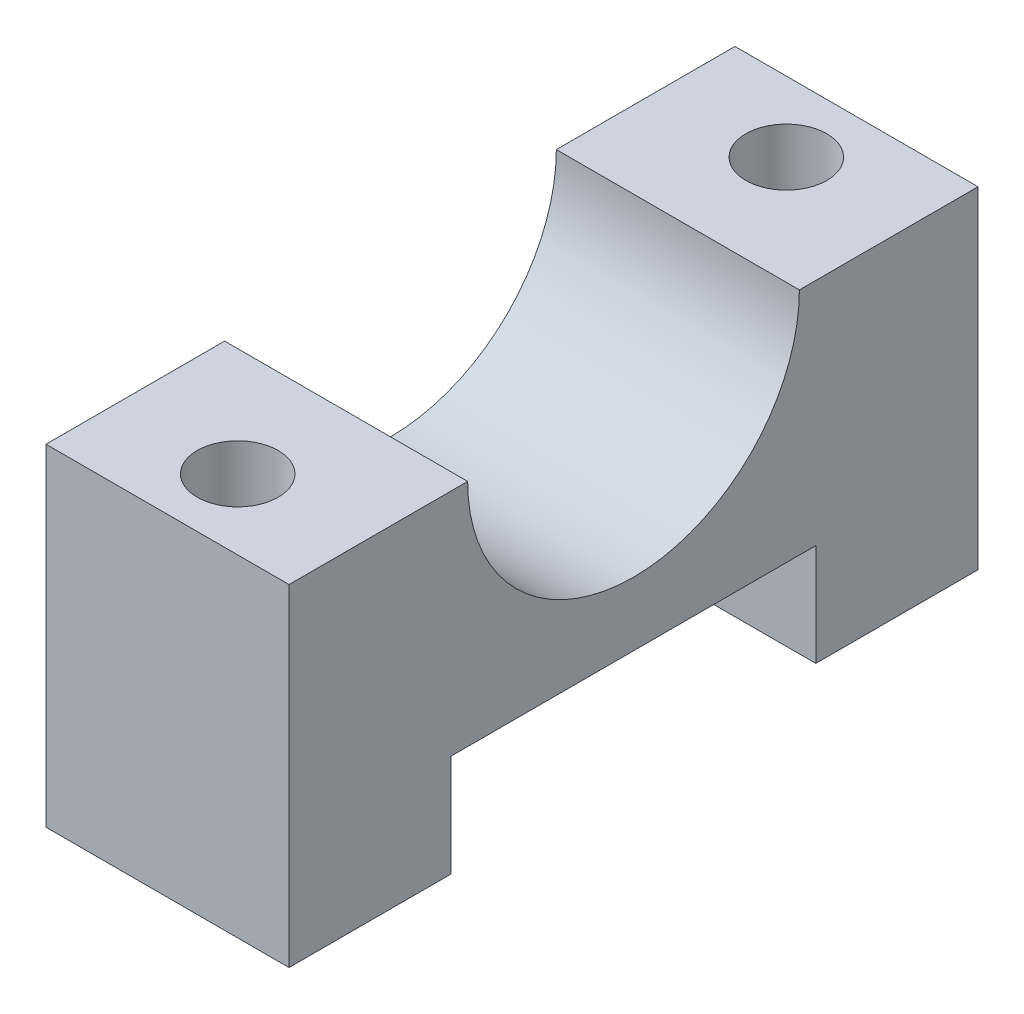
ISO-10303-21;
HEADER;
FILE_DESCRIPTION(('STEP AP214'),'2;1');
FILE_NAME('part.step','',(''),(''),'','','');
FILE_SCHEMA(('AUTOMOTIVE_DESIGN { 1 0 10303 214 1 1 1 1 }'));
ENDSEC;
DATA;
#1=APPLICATION_CONTEXT('core data for automotive mechanical design processes');
#2=APPLICATION_PROTOCOL_DEFINITION('international standard','automotive_design',2000,#1);
#3=PRODUCT_CONTEXT('',#1,'mechanical');
#4=PRODUCT('Part','Part','',(#3));
#5=PRODUCT_RELATED_PRODUCT_CATEGORY('part','',(#4));
#6=PRODUCT_DEFINITION_FORMATION('','',#4);
#7=PRODUCT_DEFINITION_CONTEXT('part definition',#1,'design');
#8=PRODUCT_DEFINITION('design','',#6,#7);
#9=PRODUCT_DEFINITION_SHAPE('','',#8);
#10=(LENGTH_UNIT() NAMED_UNIT(*) SI_UNIT(.MILLI.,.METRE.));
#11=(NAMED_UNIT(*) PLANE_ANGLE_UNIT() SI_UNIT($,.RADIAN.));
#12=(NAMED_UNIT(*) SI_UNIT($,.STERADIAN.) SOLID_ANGLE_UNIT());
#13=UNCERTAINTY_MEASURE_WITH_UNIT(LENGTH_MEASURE(1.E-05),#10,'distance_accuracy_value','');
#14=(GEOMETRIC_REPRESENTATION_CONTEXT(3) GLOBAL_UNCERTAINTY_ASSIGNED_CONTEXT((#13)) GLOBAL_UNIT_ASSIGNED_CONTEXT((#10,
#11,#12)) REPRESENTATION_CONTEXT('',''));
#15=CARTESIAN_POINT('',(0.,0.,0.));
#16=DIRECTION('',(0.,0.,1.));
#17=DIRECTION('',(1.,0.,0.));
#18=AXIS2_PLACEMENT_3D('',#15,#16,#17);
#19=CARTESIAN_POINT('',(9.525,-13.,13.5));
#20=DIRECTION('',(0.,1.,0.));
#21=DIRECTION('',(0.,0.,1.));
#22=AXIS2_PLACEMENT_3D('',#19,#20,#21);
#23=PLANE('',#22);
#24=CARTESIAN_POINT('',(4.7625,-13.,10.75));
#25=DIRECTION('',(0.,-1.,0.));
#26=DIRECTION('',(0.,0.,-1.));
#27=AXIS2_PLACEMENT_3D('',#24,#25,#26);
#28=CIRCLE('',#27,1.5875);
#29=CARTESIAN_POINT('',(4.7625,-13.,9.1625));
#30=VERTEX_POINT('',#29);
#31=EDGE_CURVE('E229',#30,#30,#28,.T.);
#32=ORIENTED_EDGE('',*,*,#31,.F.);
#33=EDGE_LOOP('',(#32));
#34=FACE_BOUND('',#33,.T.);
#35=DIRECTION('',(0.,0.,-1.));
#36=VECTOR('',#35,1.);
#37=CARTESIAN_POINT('',(0.,-13.,13.5));
#38=LINE('',#37,#36);
#39=CARTESIAN_POINT('',(0.,-13.,13.5));
#40=VERTEX_POINT('',#39);
#41=CARTESIAN_POINT('',(0.,-13.,7.14375));
#42=VERTEX_POINT('',#41);
#43=EDGE_CURVE('E137',#40,#42,#38,.T.);
#44=ORIENTED_EDGE('',*,*,#43,.T.);
#45=DIRECTION('',(1.,0.,0.));
#46=VECTOR('',#45,1.);
#47=CARTESIAN_POINT('',(0.,-13.,7.14375));
#48=LINE('',#47,#46);
#49=CARTESIAN_POINT('',(9.525,-13.,7.14375));
#50=VERTEX_POINT('',#49);
#51=EDGE_CURVE('E170',#42,#50,#48,.T.);
#52=ORIENTED_EDGE('',*,*,#51,.T.);
#53=DIRECTION('',(0.,0.,-1.));
#54=VECTOR('',#53,1.);
#55=CARTESIAN_POINT('',(9.525,-13.,13.5));
#56=LINE('',#55,#54);
#57=CARTESIAN_POINT('',(9.525,-13.,13.5));
#58=VERTEX_POINT('',#57);
#59=EDGE_CURVE('E92',#58,#50,#56,.T.);
#60=ORIENTED_EDGE('',*,*,#59,.F.);
#61=DIRECTION('',(-1.,0.,0.));
#62=VECTOR('',#61,1.);
#63=CARTESIAN_POINT('',(9.525,-13.,13.5));
#64=LINE('',#63,#62);
#65=EDGE_CURVE('E11',#58,#40,#64,.T.);
#66=ORIENTED_EDGE('',*,*,#65,.T.);
#67=EDGE_LOOP('',(#44,#52,#60,#66));
#68=FACE_BOUND('',#67,.T.);
#69=ADVANCED_FACE('F33',(#34,#68),#23,.F.);
#70=CARTESIAN_POINT('',(9.525,0.,13.5));
#71=DIRECTION('',(0.,0.,-1.));
#72=DIRECTION('',(0.,1.,0.));
#73=AXIS2_PLACEMENT_3D('',#70,#71,#72);
#74=PLANE('',#73);
#75=DIRECTION('',(0.,-1.,0.));
#76=VECTOR('',#75,1.);
#77=CARTESIAN_POINT('',(0.,0.,13.5));
#78=LINE('',#77,#76);
#79=CARTESIAN_POINT('',(0.,0.,13.5));
#80=VERTEX_POINT('',#79);
#81=EDGE_CURVE('E132',#80,#40,#78,.T.);
#82=ORIENTED_EDGE('',*,*,#81,.T.);
#83=ORIENTED_EDGE('',*,*,#65,.F.);
#84=DIRECTION('',(0.,-1.,0.));
#85=VECTOR('',#84,1.);
#86=CARTESIAN_POINT('',(9.525,0.,13.5));
#87=LINE('',#86,#85);
#88=CARTESIAN_POINT('',(9.525,0.,13.5));
#89=VERTEX_POINT('',#88);
#90=EDGE_CURVE('E146',#89,#58,#87,.T.);
#91=ORIENTED_EDGE('',*,*,#90,.F.);
#92=DIRECTION('',(-1.,0.,0.));
#93=VECTOR('',#92,1.);
#94=CARTESIAN_POINT('',(9.525,0.,13.5));
#95=LINE('',#94,#93);
#96=EDGE_CURVE('E128',#89,#80,#95,.T.);
#97=ORIENTED_EDGE('',*,*,#96,.T.);
#98=EDGE_LOOP('',(#82,#83,#91,#97));
#99=FACE_BOUND('',#98,.T.);
#100=ADVANCED_FACE('F35',(#99),#74,.F.);
#101=CARTESIAN_POINT('',(4.7625,-13.,-10.75));
#102=DIRECTION('',(0.,-1.,0.));
#103=DIRECTION('',(0.,0.,-1.));
#104=AXIS2_PLACEMENT_3D('',#101,#102,#103);
#105=CIRCLE('',#104,1.5875);
#106=CARTESIAN_POINT('',(4.7625,-13.,-12.3375));
#107=VERTEX_POINT('',#106);
#108=EDGE_CURVE('E234',#107,#107,#105,.T.);
#109=ORIENTED_EDGE('',*,*,#108,.F.);
#110=EDGE_LOOP('',(#109));
#111=FACE_BOUND('',#110,.T.);
#112=CARTESIAN_POINT('',(9.525,-13.,-7.14375));
#113=VERTEX_POINT('',#112);
#114=CARTESIAN_POINT('',(9.525,-13.,-13.5));
#115=VERTEX_POINT('',#114);
#116=EDGE_CURVE('E166',#113,#115,#56,.T.);
#117=ORIENTED_EDGE('',*,*,#116,.F.);
#118=DIRECTION('',(1.,0.,0.));
#119=VECTOR('',#118,1.);
#120=CARTESIAN_POINT('',(0.,-13.,-7.14375));
#121=LINE('',#120,#119);
#122=CARTESIAN_POINT('',(0.,-13.,-7.14375));
#123=VERTEX_POINT('',#122);
#124=EDGE_CURVE('E204',#123,#113,#121,.T.);
#125=ORIENTED_EDGE('',*,*,#124,.F.);
#126=CARTESIAN_POINT('',(0.,-13.,-13.5));
#127=VERTEX_POINT('',#126);
#128=EDGE_CURVE('E135',#123,#127,#38,.T.);
#129=ORIENTED_EDGE('',*,*,#128,.T.);
#130=DIRECTION('',(-1.,0.,0.));
#131=VECTOR('',#130,1.);
#132=CARTESIAN_POINT('',(9.525,-13.,-13.5));
#133=LINE('',#132,#131);
#134=EDGE_CURVE('E41',#115,#127,#133,.T.);
#135=ORIENTED_EDGE('',*,*,#134,.F.);
#136=EDGE_LOOP('',(#117,#125,#129,#135));
#137=FACE_BOUND('',#136,.T.);
#138=ADVANCED_FACE('F214',(#111,#137),#23,.F.);
#139=CARTESIAN_POINT('',(9.525,0.,-13.5));
#140=DIRECTION('',(0.,0.,1.));
#141=DIRECTION('',(0.,-1.,0.));
#142=AXIS2_PLACEMENT_3D('',#139,#140,#141);
#143=PLANE('',#142);
#144=DIRECTION('',(0.,1.,0.));
#145=VECTOR('',#144,1.);
#146=CARTESIAN_POINT('',(0.,0.,-13.5));
#147=LINE('',#146,#145);
#148=CARTESIAN_POINT('',(0.,0.,-13.5));
#149=VERTEX_POINT('',#148);
#150=EDGE_CURVE('E140',#127,#149,#147,.T.);
#151=ORIENTED_EDGE('',*,*,#150,.T.);
#152=DIRECTION('',(-1.,0.,0.));
#153=VECTOR('',#152,1.);
#154=CARTESIAN_POINT('',(9.525,0.,-13.5));
#155=LINE('',#154,#153);
#156=CARTESIAN_POINT('',(9.525,0.,-13.5));
#157=VERTEX_POINT('',#156);
#158=EDGE_CURVE('E123',#157,#149,#155,.T.);
#159=ORIENTED_EDGE('',*,*,#158,.F.);
#160=DIRECTION('',(0.,1.,0.));
#161=VECTOR('',#160,1.);
#162=CARTESIAN_POINT('',(9.525,0.,-13.5));
#163=LINE('',#162,#161);
#164=EDGE_CURVE('E111',#115,#157,#163,.T.);
#165=ORIENTED_EDGE('',*,*,#164,.F.);
#166=ORIENTED_EDGE('',*,*,#134,.T.);
#167=EDGE_LOOP('',(#151,#159,#165,#166));
#168=FACE_BOUND('',#167,.T.);
#169=ADVANCED_FACE('F153',(#168),#143,.F.);
#170=CARTESIAN_POINT('',(9.525,0.,-6.5));
#171=DIRECTION('',(0.,-1.,0.));
#172=DIRECTION('',(0.,0.,-1.));
#173=AXIS2_PLACEMENT_3D('',#170,#171,#172);
#174=PLANE('',#173);
#175=CARTESIAN_POINT('',(4.7625,0.,-10.75));
#176=DIRECTION('',(0.,-1.,0.));
#177=DIRECTION('',(0.,0.,-1.));
#178=AXIS2_PLACEMENT_3D('',#175,#176,#177);
#179=CIRCLE('',#178,1.5875);
#180=CARTESIAN_POINT('',(4.7625,0.,-12.3375));
#181=VERTEX_POINT('',#180);
#182=EDGE_CURVE('E209',#181,#181,#179,.T.);
#183=ORIENTED_EDGE('',*,*,#182,.T.);
#184=EDGE_LOOP('',(#183));
#185=FACE_BOUND('',#184,.T.);
#186=DIRECTION('',(0.,0.,1.));
#187=VECTOR('',#186,1.);
#188=CARTESIAN_POINT('',(0.,0.,-6.5));
#189=LINE('',#188,#187);
#190=CARTESIAN_POINT('',(0.,0.,-6.5));
#191=VERTEX_POINT('',#190);
#192=EDGE_CURVE('E120',#149,#191,#189,.T.);
#193=ORIENTED_EDGE('',*,*,#192,.T.);
#194=DIRECTION('',(-1.,0.,0.));
#195=VECTOR('',#194,1.);
#196=CARTESIAN_POINT('',(9.525,0.,-6.5));
#197=LINE('',#196,#195);
#198=CARTESIAN_POINT('',(9.525,0.,-6.5));
#199=VERTEX_POINT('',#198);
#200=EDGE_CURVE('E117',#199,#191,#197,.T.);
#201=ORIENTED_EDGE('',*,*,#200,.F.);
#202=DIRECTION('',(0.,0.,1.));
#203=VECTOR('',#202,1.);
#204=CARTESIAN_POINT('',(9.525,0.,-6.5));
#205=LINE('',#204,#203);
#206=EDGE_CURVE('E103',#157,#199,#205,.T.);
#207=ORIENTED_EDGE('',*,*,#206,.F.);
#208=ORIENTED_EDGE('',*,*,#158,.T.);
#209=EDGE_LOOP('',(#193,#201,#207,#208));
#210=FACE_BOUND('',#209,.T.);
#211=ADVANCED_FACE('F118',(#185,#210),#174,.F.);
#212=CARTESIAN_POINT('',(9.525,0.,0.));
#213=DIRECTION('',(-1.,0.,0.));
#214=DIRECTION('',(0.,0.,1.));
#215=AXIS2_PLACEMENT_3D('',#212,#213,#214);
#216=CYLINDRICAL_SURFACE('',#215,6.5);
#217=CARTESIAN_POINT('',(0.,0.,0.));
#218=DIRECTION('',(-1.,0.,0.));
#219=DIRECTION('',(0.,0.,-1.));
#220=AXIS2_PLACEMENT_3D('',#217,#218,#219);
#221=CIRCLE('',#220,6.5);
#222=CARTESIAN_POINT('',(0.,0.,6.5));
#223=VERTEX_POINT('',#222);
#224=EDGE_CURVE('E143',#191,#223,#221,.T.);
#225=ORIENTED_EDGE('',*,*,#224,.T.);
#226=DIRECTION('',(-1.,0.,0.));
#227=VECTOR('',#226,1.);
#228=CARTESIAN_POINT('',(9.525,0.,6.5));
#229=LINE('',#228,#227);
#230=CARTESIAN_POINT('',(9.525,0.,6.5));
#231=VERTEX_POINT('',#230);
#232=EDGE_CURVE('E124',#231,#223,#229,.T.);
#233=ORIENTED_EDGE('',*,*,#232,.F.);
#234=CARTESIAN_POINT('',(9.525,0.,0.));
#235=DIRECTION('',(-1.,0.,0.));
#236=DIRECTION('',(0.,0.,-1.));
#237=AXIS2_PLACEMENT_3D('',#234,#235,#236);
#238=CIRCLE('',#237,6.5);
#239=EDGE_CURVE('E108',#199,#231,#238,.T.);
#240=ORIENTED_EDGE('',*,*,#239,.F.);
#241=ORIENTED_EDGE('',*,*,#200,.T.);
#242=EDGE_LOOP('',(#225,#233,#240,#241));
#243=FACE_BOUND('',#242,.T.);
#244=ADVANCED_FACE('F126',(#243),#216,.F.);
#245=CARTESIAN_POINT('',(9.525,0.,13.5));
#246=DIRECTION('',(0.,-1.,0.));
#247=DIRECTION('',(0.,0.,-1.));
#248=AXIS2_PLACEMENT_3D('',#245,#246,#247);
#249=PLANE('',#248);
#250=CARTESIAN_POINT('',(4.7625,0.,10.75));
#251=DIRECTION('',(0.,-1.,0.));
#252=DIRECTION('',(0.,0.,-1.));
#253=AXIS2_PLACEMENT_3D('',#250,#251,#252);
#254=CIRCLE('',#253,1.5875);
#255=CARTESIAN_POINT('',(4.7625,0.,9.1625));
#256=VERTEX_POINT('',#255);
#257=EDGE_CURVE('E231',#256,#256,#254,.T.);
#258=ORIENTED_EDGE('',*,*,#257,.T.);
#259=EDGE_LOOP('',(#258));
#260=FACE_BOUND('',#259,.T.);
#261=DIRECTION('',(0.,0.,1.));
#262=VECTOR('',#261,1.);
#263=CARTESIAN_POINT('',(0.,0.,13.5));
#264=LINE('',#263,#262);
#265=EDGE_CURVE('E84',#223,#80,#264,.T.);
#266=ORIENTED_EDGE('',*,*,#265,.T.);
#267=ORIENTED_EDGE('',*,*,#96,.F.);
#268=DIRECTION('',(0.,0.,1.));
#269=VECTOR('',#268,1.);
#270=CARTESIAN_POINT('',(9.525,0.,13.5));
#271=LINE('',#270,#269);
#272=EDGE_CURVE('E57',#231,#89,#271,.T.);
#273=ORIENTED_EDGE('',*,*,#272,.F.);
#274=ORIENTED_EDGE('',*,*,#232,.T.);
#275=EDGE_LOOP('',(#266,#267,#273,#274));
#276=FACE_BOUND('',#275,.T.);
#277=ADVANCED_FACE('F162',(#260,#276),#249,.F.);
#278=CARTESIAN_POINT('',(9.525,0.,0.));
#279=DIRECTION('',(1.,0.,0.));
#280=DIRECTION('',(0.,0.,-1.));
#281=AXIS2_PLACEMENT_3D('',#278,#279,#280);
#282=PLANE('',#281);
#283=DIRECTION('',(0.,-1.,0.));
#284=VECTOR('',#283,1.);
#285=CARTESIAN_POINT('',(9.525,-9.,7.14375));
#286=LINE('',#285,#284);
#287=CARTESIAN_POINT('',(9.525,-9.,7.14375));
#288=VERTEX_POINT('',#287);
#289=EDGE_CURVE('E175',#288,#50,#286,.T.);
#290=ORIENTED_EDGE('',*,*,#289,.F.);
#291=DIRECTION('',(0.,0.,1.));
#292=VECTOR('',#291,1.);
#293=CARTESIAN_POINT('',(9.525,-9.,7.14375));
#294=LINE('',#293,#292);
#295=CARTESIAN_POINT('',(9.525,-9.,-7.14375));
#296=VERTEX_POINT('',#295);
#297=EDGE_CURVE('E198',#296,#288,#294,.T.);
#298=ORIENTED_EDGE('',*,*,#297,.F.);
#299=DIRECTION('',(0.,1.,0.));
#300=VECTOR('',#299,1.);
#301=CARTESIAN_POINT('',(9.525,-9.,-7.14375));
#302=LINE('',#301,#300);
#303=EDGE_CURVE('E208',#113,#296,#302,.T.);
#304=ORIENTED_EDGE('',*,*,#303,.F.);
#305=ORIENTED_EDGE('',*,*,#116,.T.);
#306=ORIENTED_EDGE('',*,*,#164,.T.);
#307=ORIENTED_EDGE('',*,*,#206,.T.);
#308=ORIENTED_EDGE('',*,*,#239,.T.);
#309=ORIENTED_EDGE('',*,*,#272,.T.);
#310=ORIENTED_EDGE('',*,*,#90,.T.);
#311=ORIENTED_EDGE('',*,*,#59,.T.);
#312=EDGE_LOOP('',(#290,#298,#304,#305,#306,#307,#308,#309,#310,#311));
#313=FACE_BOUND('',#312,.T.);
#314=ADVANCED_FACE('F106',(#313),#282,.T.);
#315=CARTESIAN_POINT('',(0.,0.,0.));
#316=DIRECTION('',(1.,0.,0.));
#317=DIRECTION('',(0.,0.,-1.));
#318=AXIS2_PLACEMENT_3D('',#315,#316,#317);
#319=PLANE('',#318);
#320=DIRECTION('',(0.,0.,1.));
#321=VECTOR('',#320,1.);
#322=CARTESIAN_POINT('',(0.,-9.,7.14375));
#323=LINE('',#322,#321);
#324=CARTESIAN_POINT('',(0.,-9.,-7.14375));
#325=VERTEX_POINT('',#324);
#326=CARTESIAN_POINT('',(0.,-9.,7.14375));
#327=VERTEX_POINT('',#326);
#328=EDGE_CURVE('E48',#325,#327,#323,.T.);
#329=ORIENTED_EDGE('',*,*,#328,.T.);
#330=DIRECTION('',(0.,-1.,0.));
#331=VECTOR('',#330,1.);
#332=CARTESIAN_POINT('',(0.,-9.,7.14375));
#333=LINE('',#332,#331);
#334=EDGE_CURVE('E200',#327,#42,#333,.T.);
#335=ORIENTED_EDGE('',*,*,#334,.T.);
#336=ORIENTED_EDGE('',*,*,#43,.F.);
#337=ORIENTED_EDGE('',*,*,#81,.F.);
#338=ORIENTED_EDGE('',*,*,#265,.F.);
#339=ORIENTED_EDGE('',*,*,#224,.F.);
#340=ORIENTED_EDGE('',*,*,#192,.F.);
#341=ORIENTED_EDGE('',*,*,#150,.F.);
#342=ORIENTED_EDGE('',*,*,#128,.F.);
#343=DIRECTION('',(0.,1.,0.));
#344=VECTOR('',#343,1.);
#345=CARTESIAN_POINT('',(0.,-9.,-7.14375));
#346=LINE('',#345,#344);
#347=EDGE_CURVE('E195',#123,#325,#346,.T.);
#348=ORIENTED_EDGE('',*,*,#347,.T.);
#349=EDGE_LOOP('',(#329,#335,#336,#337,#338,#339,#340,#341,#342,#348));
#350=FACE_BOUND('',#349,.T.);
#351=ADVANCED_FACE('F158',(#350),#319,.F.);
#352=CARTESIAN_POINT('',(0.,-9.,7.14375));
#353=DIRECTION('',(0.,0.,1.));
#354=DIRECTION('',(1.,0.,0.));
#355=AXIS2_PLACEMENT_3D('',#352,#353,#354);
#356=PLANE('',#355);
#357=ORIENTED_EDGE('',*,*,#289,.T.);
#358=ORIENTED_EDGE('',*,*,#51,.F.);
#359=ORIENTED_EDGE('',*,*,#334,.F.);
#360=DIRECTION('',(1.,0.,0.));
#361=VECTOR('',#360,1.);
#362=CARTESIAN_POINT('',(0.,-9.,7.14375));
#363=LINE('',#362,#361);
#364=EDGE_CURVE('E136',#327,#288,#363,.T.);
#365=ORIENTED_EDGE('',*,*,#364,.T.);
#366=EDGE_LOOP('',(#357,#358,#359,#365));
#367=FACE_BOUND('',#366,.T.);
#368=ADVANCED_FACE('F201',(#367),#356,.F.);
#369=CARTESIAN_POINT('',(0.,-9.,7.14375));
#370=DIRECTION('',(0.,1.,0.));
#371=DIRECTION('',(0.,0.,1.));
#372=AXIS2_PLACEMENT_3D('',#369,#370,#371);
#373=PLANE('',#372);
#374=ORIENTED_EDGE('',*,*,#297,.T.);
#375=ORIENTED_EDGE('',*,*,#364,.F.);
#376=ORIENTED_EDGE('',*,*,#328,.F.);
#377=DIRECTION('',(1.,0.,0.));
#378=VECTOR('',#377,1.);
#379=CARTESIAN_POINT('',(0.,-9.,-7.14375));
#380=LINE('',#379,#378);
#381=EDGE_CURVE('E187',#325,#296,#380,.T.);
#382=ORIENTED_EDGE('',*,*,#381,.T.);
#383=EDGE_LOOP('',(#374,#375,#376,#382));
#384=FACE_BOUND('',#383,.T.);
#385=ADVANCED_FACE('F197',(#384),#373,.F.);
#386=CARTESIAN_POINT('',(0.,-9.,-7.14375));
#387=DIRECTION('',(0.,0.,-1.));
#388=DIRECTION('',(0.,1.,0.));
#389=AXIS2_PLACEMENT_3D('',#386,#387,#388);
#390=PLANE('',#389);
#391=ORIENTED_EDGE('',*,*,#303,.T.);
#392=ORIENTED_EDGE('',*,*,#381,.F.);
#393=ORIENTED_EDGE('',*,*,#347,.F.);
#394=ORIENTED_EDGE('',*,*,#124,.T.);
#395=EDGE_LOOP('',(#391,#392,#393,#394));
#396=FACE_BOUND('',#395,.T.);
#397=ADVANCED_FACE('F213',(#396),#390,.F.);
#398=CARTESIAN_POINT('',(4.7625,0.,-10.75));
#399=DIRECTION('',(0.,-1.,0.));
#400=DIRECTION('',(0.,0.,-1.));
#401=AXIS2_PLACEMENT_3D('',#398,#399,#400);
#402=CYLINDRICAL_SURFACE('',#401,1.5875);
#403=CARTESIAN_POINT('',(4.7625,0.,-12.3375));
#404=CARTESIAN_POINT('',(4.7625,-0.135416666666667,-12.3375));
#405=CARTESIAN_POINT('',(4.7625,-0.270833333333333,-12.3375));
#406=CARTESIAN_POINT('',(4.7625,-0.541666666666667,-12.3375));
#407=CARTESIAN_POINT('',(4.7625,-0.677083333333333,-12.3375));
#408=CARTESIAN_POINT('',(4.7625,-0.947916666666667,-12.3375));
#409=CARTESIAN_POINT('',(4.7625,-1.08333333333333,-12.3375));
#410=CARTESIAN_POINT('',(4.7625,-1.35416666666667,-12.3375));
#411=CARTESIAN_POINT('',(4.7625,-1.48958333333333,-12.3375));
#412=CARTESIAN_POINT('',(4.7625,-1.76041666666667,-12.3375));
#413=CARTESIAN_POINT('',(4.7625,-1.89583333333333,-12.3375));
#414=CARTESIAN_POINT('',(4.7625,-2.16666666666667,-12.3375));
#415=CARTESIAN_POINT('',(4.7625,-2.30208333333333,-12.3375));
#416=CARTESIAN_POINT('',(4.7625,-2.57291666666667,-12.3375));
#417=CARTESIAN_POINT('',(4.7625,-2.70833333333333,-12.3375));
#418=CARTESIAN_POINT('',(4.7625,-2.97916666666667,-12.3375));
#419=CARTESIAN_POINT('',(4.7625,-3.11458333333333,-12.3375));
#420=CARTESIAN_POINT('',(4.7625,-3.38541666666667,-12.3375));
#421=CARTESIAN_POINT('',(4.7625,-3.52083333333333,-12.3375));
#422=CARTESIAN_POINT('',(4.7625,-3.79166666666667,-12.3375));
#423=CARTESIAN_POINT('',(4.7625,-3.92708333333333,-12.3375));
#424=CARTESIAN_POINT('',(4.7625,-4.19791666666667,-12.3375));
#425=CARTESIAN_POINT('',(4.7625,-4.33333333333333,-12.3375));
#426=CARTESIAN_POINT('',(4.7625,-4.60416666666667,-12.3375));
#427=CARTESIAN_POINT('',(4.7625,-4.73958333333333,-12.3375));
#428=CARTESIAN_POINT('',(4.7625,-5.01041666666667,-12.3375));
#429=CARTESIAN_POINT('',(4.7625,-5.14583333333333,-12.3375));
#430=CARTESIAN_POINT('',(4.7625,-5.41666666666667,-12.3375));
#431=CARTESIAN_POINT('',(4.7625,-5.55208333333333,-12.3375));
#432=CARTESIAN_POINT('',(4.7625,-5.82291666666667,-12.3375));
#433=CARTESIAN_POINT('',(4.7625,-5.95833333333333,-12.3375));
#434=CARTESIAN_POINT('',(4.7625,-6.22916666666667,-12.3375));
#435=CARTESIAN_POINT('',(4.7625,-6.36458333333333,-12.3375));
#436=CARTESIAN_POINT('',(4.7625,-6.63541666666667,-12.3375));
#437=CARTESIAN_POINT('',(4.7625,-6.77083333333333,-12.3375));
#438=CARTESIAN_POINT('',(4.7625,-7.04166666666667,-12.3375));
#439=CARTESIAN_POINT('',(4.7625,-7.17708333333333,-12.3375));
#440=CARTESIAN_POINT('',(4.7625,-7.44791666666667,-12.3375));
#441=CARTESIAN_POINT('',(4.7625,-7.58333333333333,-12.3375));
#442=CARTESIAN_POINT('',(4.7625,-7.85416666666667,-12.3375));
#443=CARTESIAN_POINT('',(4.7625,-7.98958333333333,-12.3375));
#444=CARTESIAN_POINT('',(4.7625,-8.26041666666667,-12.3375));
#445=CARTESIAN_POINT('',(4.7625,-8.39583333333333,-12.3375));
#446=CARTESIAN_POINT('',(4.7625,-8.66666666666667,-12.3375));
#447=CARTESIAN_POINT('',(4.7625,-8.80208333333333,-12.3375));
#448=CARTESIAN_POINT('',(4.7625,-9.07291666666667,-12.3375));
#449=CARTESIAN_POINT('',(4.7625,-9.20833333333333,-12.3375));
#450=CARTESIAN_POINT('',(4.7625,-9.47916666666667,-12.3375));
#451=CARTESIAN_POINT('',(4.7625,-9.61458333333333,-12.3375));
#452=CARTESIAN_POINT('',(4.7625,-9.88541666666667,-12.3375));
#453=CARTESIAN_POINT('',(4.7625,-10.0208333333333,-12.3375));
#454=CARTESIAN_POINT('',(4.7625,-10.2916666666667,-12.3375));
#455=CARTESIAN_POINT('',(4.7625,-10.4270833333333,-12.3375));
#456=CARTESIAN_POINT('',(4.7625,-10.6979166666667,-12.3375));
#457=CARTESIAN_POINT('',(4.7625,-10.8333333333333,-12.3375));
#458=CARTESIAN_POINT('',(4.7625,-11.1041666666667,-12.3375));
#459=CARTESIAN_POINT('',(4.7625,-11.2395833333333,-12.3375));
#460=CARTESIAN_POINT('',(4.7625,-11.5104166666667,-12.3375));
#461=CARTESIAN_POINT('',(4.7625,-11.6458333333333,-12.3375));
#462=CARTESIAN_POINT('',(4.7625,-11.9166666666667,-12.3375));
#463=CARTESIAN_POINT('',(4.7625,-12.0520833333333,-12.3375));
#464=CARTESIAN_POINT('',(4.7625,-12.3229166666667,-12.3375));
#465=CARTESIAN_POINT('',(4.7625,-12.4583333333333,-12.3375));
#466=CARTESIAN_POINT('',(4.7625,-12.7291666666667,-12.3375));
#467=CARTESIAN_POINT('',(4.7625,-12.8645833333333,-12.3375));
#468=CARTESIAN_POINT('',(4.7625,-13.,-12.3375));
#469=B_SPLINE_CURVE_WITH_KNOTS('',3,(#403,#404,#405,#406,#407,#408,#409,#410,#411,#412,#413,
#414,#415,#416,#417,#418,#419,#420,#421,#422,#423,#424,#425,#426,#427,#428,#429,#430,#431,#432,
#433,#434,#435,#436,#437,#438,#439,#440,#441,#442,#443,#444,#445,#446,#447,#448,#449,#450,#451,
#452,#453,#454,#455,#456,#457,#458,#459,#460,#461,#462,#463,#464,#465,#466,#467,#468),
.UNSPECIFIED.,.F.,.F.,(4,2,2,2,2,2,2,2,2,2,2,2,2,2,2,2,2,2,2,2,2,2,2,2,2,2,2,2,2,2,2,2,4),(0.,
0.40625,0.8125,1.21875,1.625,2.03125,2.4375,2.84375,3.25,3.65625,4.0625,4.46875,4.875,5.28125,
5.6875,6.09375,6.5,6.90625,7.3125,7.71875,8.125,8.53125,8.9375,9.34375,9.75,10.15625,10.5625,
10.96875,11.375,11.78125,12.1875,12.59375,13.),.UNSPECIFIED.);
#470=EDGE_CURVE('BSEAM241',#181,#107,#469,.T.);
#471=ORIENTED_EDGE('',*,*,#182,.F.);
#472=ORIENTED_EDGE('',*,*,#108,.T.);
#473=ORIENTED_EDGE('',*,*,#470,.T.);
#474=ORIENTED_EDGE('',*,*,#470,.F.);
#475=EDGE_LOOP('',(#471,#473,#472,#474));
#476=FACE_BOUND('',#475,.T.);
#477=ADVANCED_FACE('F241',(#476),#402,.F.);
#478=CARTESIAN_POINT('',(4.7625,0.,10.75));
#479=DIRECTION('',(0.,-1.,0.));
#480=DIRECTION('',(0.,0.,-1.));
#481=AXIS2_PLACEMENT_3D('',#478,#479,#480);
#482=CYLINDRICAL_SURFACE('',#481,1.5875);
#483=CARTESIAN_POINT('',(4.7625,0.,9.1625));
#484=CARTESIAN_POINT('',(4.7625,-0.135416666666666,9.1625));
#485=CARTESIAN_POINT('',(4.7625,-0.270833333333333,9.1625));
#486=CARTESIAN_POINT('',(4.7625,-0.541666666666667,9.1625));
#487=CARTESIAN_POINT('',(4.7625,-0.677083333333333,9.1625));
#488=CARTESIAN_POINT('',(4.7625,-0.947916666666667,9.1625));
#489=CARTESIAN_POINT('',(4.7625,-1.08333333333333,9.1625));
#490=CARTESIAN_POINT('',(4.7625,-1.35416666666667,9.1625));
#491=CARTESIAN_POINT('',(4.7625,-1.48958333333333,9.1625));
#492=CARTESIAN_POINT('',(4.7625,-1.76041666666667,9.1625));
#493=CARTESIAN_POINT('',(4.7625,-1.89583333333333,9.1625));
#494=CARTESIAN_POINT('',(4.7625,-2.16666666666667,9.1625));
#495=CARTESIAN_POINT('',(4.7625,-2.30208333333333,9.1625));
#496=CARTESIAN_POINT('',(4.7625,-2.57291666666667,9.1625));
#497=CARTESIAN_POINT('',(4.7625,-2.70833333333333,9.1625));
#498=CARTESIAN_POINT('',(4.7625,-2.97916666666667,9.1625));
#499=CARTESIAN_POINT('',(4.7625,-3.11458333333333,9.1625));
#500=CARTESIAN_POINT('',(4.7625,-3.38541666666667,9.1625));
#501=CARTESIAN_POINT('',(4.7625,-3.52083333333333,9.1625));
#502=CARTESIAN_POINT('',(4.7625,-3.79166666666667,9.1625));
#503=CARTESIAN_POINT('',(4.7625,-3.92708333333333,9.1625));
#504=CARTESIAN_POINT('',(4.7625,-4.19791666666667,9.1625));
#505=CARTESIAN_POINT('',(4.7625,-4.33333333333333,9.1625));
#506=CARTESIAN_POINT('',(4.7625,-4.60416666666667,9.1625));
#507=CARTESIAN_POINT('',(4.7625,-4.73958333333333,9.1625));
#508=CARTESIAN_POINT('',(4.7625,-5.01041666666667,9.1625));
#509=CARTESIAN_POINT('',(4.7625,-5.14583333333333,9.1625));
#510=CARTESIAN_POINT('',(4.7625,-5.41666666666667,9.1625));
#511=CARTESIAN_POINT('',(4.7625,-5.55208333333333,9.1625));
#512=CARTESIAN_POINT('',(4.7625,-5.82291666666667,9.1625));
#513=CARTESIAN_POINT('',(4.7625,-5.95833333333333,9.1625));
#514=CARTESIAN_POINT('',(4.7625,-6.22916666666667,9.1625));
#515=CARTESIAN_POINT('',(4.7625,-6.36458333333333,9.1625));
#516=CARTESIAN_POINT('',(4.7625,-6.63541666666667,9.1625));
#517=CARTESIAN_POINT('',(4.7625,-6.77083333333333,9.1625));
#518=CARTESIAN_POINT('',(4.7625,-7.04166666666667,9.1625));
#519=CARTESIAN_POINT('',(4.7625,-7.17708333333333,9.1625));
#520=CARTESIAN_POINT('',(4.7625,-7.44791666666667,9.1625));
#521=CARTESIAN_POINT('',(4.7625,-7.58333333333333,9.1625));
#522=CARTESIAN_POINT('',(4.7625,-7.85416666666667,9.1625));
#523=CARTESIAN_POINT('',(4.7625,-7.98958333333333,9.1625));
#524=CARTESIAN_POINT('',(4.7625,-8.26041666666667,9.1625));
#525=CARTESIAN_POINT('',(4.7625,-8.39583333333333,9.1625));
#526=CARTESIAN_POINT('',(4.7625,-8.66666666666667,9.1625));
#527=CARTESIAN_POINT('',(4.7625,-8.80208333333333,9.1625));
#528=CARTESIAN_POINT('',(4.7625,-9.07291666666667,9.1625));
#529=CARTESIAN_POINT('',(4.7625,-9.20833333333333,9.1625));
#530=CARTESIAN_POINT('',(4.7625,-9.47916666666667,9.1625));
#531=CARTESIAN_POINT('',(4.7625,-9.61458333333333,9.1625));
#532=CARTESIAN_POINT('',(4.7625,-9.88541666666667,9.1625));
#533=CARTESIAN_POINT('',(4.7625,-10.0208333333333,9.1625));
#534=CARTESIAN_POINT('',(4.7625,-10.2916666666667,9.1625));
#535=CARTESIAN_POINT('',(4.7625,-10.4270833333333,9.1625));
#536=CARTESIAN_POINT('',(4.7625,-10.6979166666667,9.1625));
#537=CARTESIAN_POINT('',(4.7625,-10.8333333333333,9.1625));
#538=CARTESIAN_POINT('',(4.7625,-11.1041666666667,9.1625));
#539=CARTESIAN_POINT('',(4.7625,-11.2395833333333,9.1625));
#540=CARTESIAN_POINT('',(4.7625,-11.5104166666667,9.1625));
#541=CARTESIAN_POINT('',(4.7625,-11.6458333333333,9.1625));
#542=CARTESIAN_POINT('',(4.7625,-11.9166666666667,9.1625));
#543=CARTESIAN_POINT('',(4.7625,-12.0520833333333,9.1625));
#544=CARTESIAN_POINT('',(4.7625,-12.3229166666667,9.1625));
#545=CARTESIAN_POINT('',(4.7625,-12.4583333333333,9.1625));
#546=CARTESIAN_POINT('',(4.7625,-12.7291666666667,9.1625));
#547=CARTESIAN_POINT('',(4.7625,-12.8645833333333,9.1625));
#548=CARTESIAN_POINT('',(4.7625,-13.,9.1625));
#549=B_SPLINE_CURVE_WITH_KNOTS('',3,(#483,#484,#485,#486,#487,#488,#489,#490,#491,#492,#493,
#494,#495,#496,#497,#498,#499,#500,#501,#502,#503,#504,#505,#506,#507,#508,#509,#510,#511,#512,
#513,#514,#515,#516,#517,#518,#519,#520,#521,#522,#523,#524,#525,#526,#527,#528,#529,#530,#531,
#532,#533,#534,#535,#536,#537,#538,#539,#540,#541,#542,#543,#544,#545,#546,#547,#548),
.UNSPECIFIED.,.F.,.F.,(4,2,2,2,2,2,2,2,2,2,2,2,2,2,2,2,2,2,2,2,2,2,2,2,2,2,2,2,2,2,2,2,4),(0.,
0.40625,0.8125,1.21875,1.625,2.03125,2.4375,2.84375,3.25,3.65625,4.0625,4.46875,4.875,5.28125,
5.6875,6.09375,6.5,6.90625,7.3125,7.71875,8.125,8.53125,8.9375,9.34375,9.75,10.15625,10.5625,
10.96875,11.375,11.78125,12.1875,12.59375,13.),.UNSPECIFIED.);
#550=EDGE_CURVE('BSEAM243',#256,#30,#549,.T.);
#551=ORIENTED_EDGE('',*,*,#257,.F.);
#552=ORIENTED_EDGE('',*,*,#31,.T.);
#553=ORIENTED_EDGE('',*,*,#550,.T.);
#554=ORIENTED_EDGE('',*,*,#550,.F.);
#555=EDGE_LOOP('',(#551,#553,#552,#554));
#556=FACE_BOUND('',#555,.T.);
#557=ADVANCED_FACE('F243',(#556),#482,.F.);
#558=CLOSED_SHELL('',(#69,#100,#138,#169,#211,#244,#277,#314,#351,#368,#385,#397,#477,#557));
#559=MANIFOLD_SOLID_BREP('B2',#558);
#560=ADVANCED_BREP_SHAPE_REPRESENTATION('',(#18,#559),#14);
#561=SHAPE_DEFINITION_REPRESENTATION(#9,#560);
ENDSEC;
END-ISO-10303-21;
